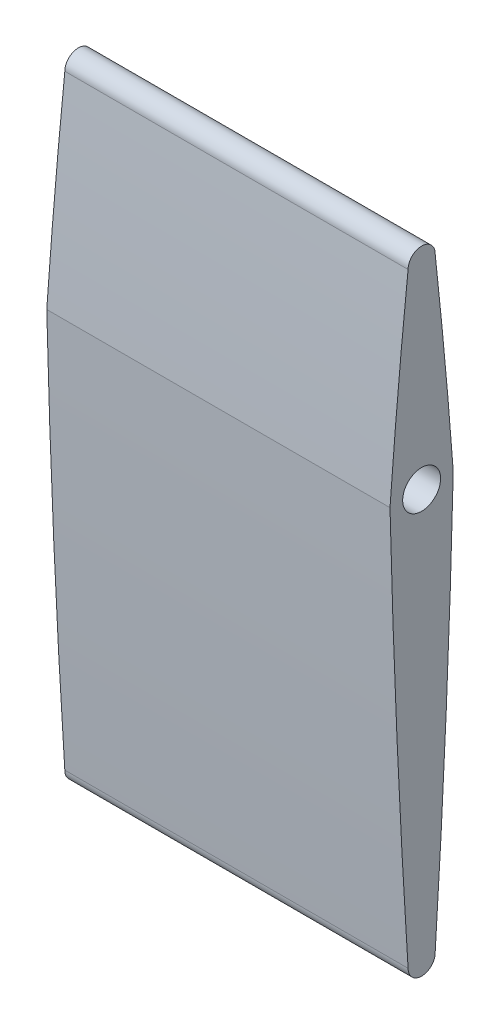
ISO-10303-21;
HEADER;
FILE_DESCRIPTION(('STEP AP214'),'2;1');
FILE_NAME('part.step','',(''),(''),'','','');
FILE_SCHEMA(('AUTOMOTIVE_DESIGN { 1 0 10303 214 1 1 1 1 }'));
ENDSEC;
DATA;
#1=APPLICATION_CONTEXT('core data for automotive mechanical design processes');
#2=APPLICATION_PROTOCOL_DEFINITION('international standard','automotive_design',2000,#1);
#3=PRODUCT_CONTEXT('',#1,'mechanical');
#4=PRODUCT('Part','Part','',(#3));
#5=PRODUCT_RELATED_PRODUCT_CATEGORY('part','',(#4));
#6=PRODUCT_DEFINITION_FORMATION('','',#4);
#7=PRODUCT_DEFINITION_CONTEXT('part definition',#1,'design');
#8=PRODUCT_DEFINITION('design','',#6,#7);
#9=PRODUCT_DEFINITION_SHAPE('','',#8);
#10=(LENGTH_UNIT() NAMED_UNIT(*) SI_UNIT(.MILLI.,.METRE.));
#11=(NAMED_UNIT(*) PLANE_ANGLE_UNIT() SI_UNIT($,.RADIAN.));
#12=(NAMED_UNIT(*) SI_UNIT($,.STERADIAN.) SOLID_ANGLE_UNIT());
#13=UNCERTAINTY_MEASURE_WITH_UNIT(LENGTH_MEASURE(1.E-05),#10,'distance_accuracy_value','');
#14=(GEOMETRIC_REPRESENTATION_CONTEXT(3) GLOBAL_UNCERTAINTY_ASSIGNED_CONTEXT((#13)) GLOBAL_UNIT_ASSIGNED_CONTEXT((#10,
#11,#12)) REPRESENTATION_CONTEXT('',''));
#15=CARTESIAN_POINT('',(0.,0.,0.));
#16=DIRECTION('',(0.,0.,1.));
#17=DIRECTION('',(1.,0.,0.));
#18=AXIS2_PLACEMENT_3D('',#15,#16,#17);
#19=CARTESIAN_POINT('',(38.,-10.4997287776051,889.529326925468));
#20=DIRECTION('',(1.,0.,0.));
#21=DIRECTION('',(0.,0.,-1.));
#22=AXIS2_PLACEMENT_3D('',#19,#20,#21);
#23=PLANE('',#22);
#24=CARTESIAN_POINT('',(38.,27.6308662681891,1131.50400766772));
#25=DIRECTION('',(1.,0.,0.));
#26=DIRECTION('',(0.,0.,-1.));
#27=AXIS2_PLACEMENT_3D('',#24,#25,#26);
#28=CIRCLE('',#27,1135.34028475718);
#29=CARTESIAN_POINT('',(38.,-45.1666666666667,-1.50000000000001));
#30=VERTEX_POINT('',#29);
#31=CARTESIAN_POINT('',(38.,0.,-3.49999999999995));
#32=VERTEX_POINT('',#31);
#33=EDGE_CURVE('E152',#30,#32,#28,.T.);
#34=ORIENTED_EDGE('',*,*,#33,.T.);
#35=CARTESIAN_POINT('',(38.,-48.6303238233992,647.554646183219));
#36=DIRECTION('',(1.,0.,0.));
#37=DIRECTION('',(0.,0.,-1.));
#38=AXIS2_PLACEMENT_3D('',#35,#36,#37);
#39=CIRCLE('',#38,652.868333365867);
#40=CARTESIAN_POINT('',(38.,21.8333333333333,-1.5));
#41=VERTEX_POINT('',#40);
#42=EDGE_CURVE('E100',#32,#41,#39,.T.);
#43=ORIENTED_EDGE('',*,*,#42,.T.);
#44=CARTESIAN_POINT('',(38.,21.8333333333333,0.));
#45=DIRECTION('',(1.,0.,0.));
#46=DIRECTION('',(0.,0.,-1.));
#47=AXIS2_PLACEMENT_3D('',#44,#45,#46);
#48=CIRCLE('',#47,1.5);
#49=CARTESIAN_POINT('',(38.,21.8333333333333,1.49999999999995));
#50=VERTEX_POINT('',#49);
#51=EDGE_CURVE('E113',#41,#50,#48,.T.);
#52=ORIENTED_EDGE('',*,*,#51,.T.);
#53=CARTESIAN_POINT('',(38.,-48.6303238233992,-647.554646183219));
#54=DIRECTION('',(1.,0.,0.));
#55=DIRECTION('',(0.,0.,1.));
#56=AXIS2_PLACEMENT_3D('',#53,#54,#55);
#57=CIRCLE('',#56,652.868333365867);
#58=CARTESIAN_POINT('',(38.,-5.72458747072346E-13,3.50000000000006));
#59=VERTEX_POINT('',#58);
#60=EDGE_CURVE('E107',#50,#59,#57,.T.);
#61=ORIENTED_EDGE('',*,*,#60,.T.);
#62=CARTESIAN_POINT('',(38.,27.6308662681891,-1131.50400766772));
#63=DIRECTION('',(1.,0.,0.));
#64=DIRECTION('',(0.,0.,1.));
#65=AXIS2_PLACEMENT_3D('',#62,#63,#64);
#66=CIRCLE('',#65,1135.34028475718);
#67=CARTESIAN_POINT('',(38.,-45.1666666666667,1.5));
#68=VERTEX_POINT('',#67);
#69=EDGE_CURVE('E111',#59,#68,#66,.T.);
#70=ORIENTED_EDGE('',*,*,#69,.T.);
#71=CARTESIAN_POINT('',(38.,-45.1666666666667,0.));
#72=DIRECTION('',(1.,0.,0.));
#73=DIRECTION('',(0.,0.,-1.));
#74=AXIS2_PLACEMENT_3D('',#71,#72,#73);
#75=CIRCLE('',#74,1.5);
#76=EDGE_CURVE('E63',#68,#30,#75,.T.);
#77=ORIENTED_EDGE('',*,*,#76,.T.);
#78=EDGE_LOOP('',(#34,#43,#52,#61,#70,#77));
#79=FACE_BOUND('',#78,.T.);
#80=CARTESIAN_POINT('',(38.,0.,0.));
#81=DIRECTION('',(1.,0.,0.));
#82=DIRECTION('',(0.,0.,-1.));
#83=AXIS2_PLACEMENT_3D('',#80,#81,#82);
#84=CIRCLE('',#83,2.1);
#85=CARTESIAN_POINT('',(38.,0.,-2.1));
#86=VERTEX_POINT('',#85);
#87=EDGE_CURVE('E140',#86,#86,#84,.T.);
#88=ORIENTED_EDGE('',*,*,#87,.F.);
#89=EDGE_LOOP('',(#88));
#90=FACE_BOUND('',#89,.T.);
#91=ADVANCED_FACE('F45',(#79,#90),#23,.T.);
#92=CARTESIAN_POINT('',(0.,-10.4997287776051,889.529326925468));
#93=DIRECTION('',(1.,0.,0.));
#94=DIRECTION('',(0.,0.,-1.));
#95=AXIS2_PLACEMENT_3D('',#92,#93,#94);
#96=PLANE('',#95);
#97=CARTESIAN_POINT('',(0.,27.6308662681891,1131.50400766772));
#98=DIRECTION('',(1.,0.,0.));
#99=DIRECTION('',(0.,0.,-1.));
#100=AXIS2_PLACEMENT_3D('',#97,#98,#99);
#101=CIRCLE('',#100,1135.34028475718);
#102=CARTESIAN_POINT('',(0.,-45.1666666666667,-1.50000000000001));
#103=VERTEX_POINT('',#102);
#104=CARTESIAN_POINT('',(0.,0.,-3.49999999999995));
#105=VERTEX_POINT('',#104);
#106=EDGE_CURVE('E135',#103,#105,#101,.T.);
#107=ORIENTED_EDGE('',*,*,#106,.F.);
#108=CARTESIAN_POINT('',(0.,-45.1666666666667,0.));
#109=DIRECTION('',(1.,0.,0.));
#110=DIRECTION('',(0.,0.,-1.));
#111=AXIS2_PLACEMENT_3D('',#108,#109,#110);
#112=CIRCLE('',#111,1.5);
#113=CARTESIAN_POINT('',(0.,-45.1666666666667,1.5));
#114=VERTEX_POINT('',#113);
#115=EDGE_CURVE('E92',#114,#103,#112,.T.);
#116=ORIENTED_EDGE('',*,*,#115,.F.);
#117=CARTESIAN_POINT('',(0.,27.6308662681891,-1131.50400766772));
#118=DIRECTION('',(1.,0.,0.));
#119=DIRECTION('',(0.,0.,1.));
#120=AXIS2_PLACEMENT_3D('',#117,#118,#119);
#121=CIRCLE('',#120,1135.34028475718);
#122=CARTESIAN_POINT('',(0.,-5.72458747072346E-13,3.50000000000006));
#123=VERTEX_POINT('',#122);
#124=EDGE_CURVE('E86',#123,#114,#121,.T.);
#125=ORIENTED_EDGE('',*,*,#124,.F.);
#126=CARTESIAN_POINT('',(0.,-48.6303238233992,-647.554646183219));
#127=DIRECTION('',(1.,0.,0.));
#128=DIRECTION('',(0.,0.,1.));
#129=AXIS2_PLACEMENT_3D('',#126,#127,#128);
#130=CIRCLE('',#129,652.868333365867);
#131=CARTESIAN_POINT('',(0.,21.8333333333333,1.49999999999995));
#132=VERTEX_POINT('',#131);
#133=EDGE_CURVE('E122',#132,#123,#130,.T.);
#134=ORIENTED_EDGE('',*,*,#133,.F.);
#135=CARTESIAN_POINT('',(0.,21.8333333333333,0.));
#136=DIRECTION('',(1.,0.,0.));
#137=DIRECTION('',(0.,0.,-1.));
#138=AXIS2_PLACEMENT_3D('',#135,#136,#137);
#139=CIRCLE('',#138,1.5);
#140=CARTESIAN_POINT('',(0.,21.8333333333333,-1.5));
#141=VERTEX_POINT('',#140);
#142=EDGE_CURVE('E143',#141,#132,#139,.T.);
#143=ORIENTED_EDGE('',*,*,#142,.F.);
#144=CARTESIAN_POINT('',(0.,-48.6303238233992,647.554646183219));
#145=DIRECTION('',(1.,0.,0.));
#146=DIRECTION('',(0.,0.,-1.));
#147=AXIS2_PLACEMENT_3D('',#144,#145,#146);
#148=CIRCLE('',#147,652.868333365867);
#149=EDGE_CURVE('E139',#105,#141,#148,.T.);
#150=ORIENTED_EDGE('',*,*,#149,.F.);
#151=EDGE_LOOP('',(#107,#116,#125,#134,#143,#150));
#152=FACE_BOUND('',#151,.T.);
#153=CARTESIAN_POINT('',(0.,0.,0.));
#154=DIRECTION('',(1.,0.,0.));
#155=DIRECTION('',(0.,0.,-1.));
#156=AXIS2_PLACEMENT_3D('',#153,#154,#155);
#157=CIRCLE('',#156,2.1);
#158=CARTESIAN_POINT('',(0.,0.,-2.1));
#159=VERTEX_POINT('',#158);
#160=EDGE_CURVE('E249',#159,#159,#157,.T.);
#161=ORIENTED_EDGE('',*,*,#160,.T.);
#162=EDGE_LOOP('',(#161));
#163=FACE_BOUND('',#162,.T.);
#164=ADVANCED_FACE('F165',(#152,#163),#96,.F.);
#165=CARTESIAN_POINT('',(38.,27.6308662681891,1131.50400766772));
#166=DIRECTION('',(-1.,0.,0.));
#167=DIRECTION('',(0.,0.,1.));
#168=AXIS2_PLACEMENT_3D('',#165,#166,#167);
#169=CYLINDRICAL_SURFACE('',#168,1135.34028475718);
#170=ORIENTED_EDGE('',*,*,#106,.T.);
#171=DIRECTION('',(-1.,0.,0.));
#172=VECTOR('',#171,1.);
#173=CARTESIAN_POINT('',(38.,0.,-3.49999999999995));
#174=LINE('',#173,#172);
#175=EDGE_CURVE('E11',#32,#105,#174,.T.);
#176=ORIENTED_EDGE('',*,*,#175,.F.);
#177=ORIENTED_EDGE('',*,*,#33,.F.);
#178=DIRECTION('',(-1.,0.,0.));
#179=VECTOR('',#178,1.);
#180=CARTESIAN_POINT('',(38.,-45.1666666666667,-1.50000000000001));
#181=LINE('',#180,#179);
#182=EDGE_CURVE('E131',#30,#103,#181,.T.);
#183=ORIENTED_EDGE('',*,*,#182,.T.);
#184=EDGE_LOOP('',(#170,#176,#177,#183));
#185=FACE_BOUND('',#184,.T.);
#186=ADVANCED_FACE('F47',(#185),#169,.T.);
#187=CARTESIAN_POINT('',(38.,-48.6303238233992,647.554646183219));
#188=DIRECTION('',(-1.,0.,0.));
#189=DIRECTION('',(0.,0.,1.));
#190=AXIS2_PLACEMENT_3D('',#187,#188,#189);
#191=CYLINDRICAL_SURFACE('',#190,652.868333365867);
#192=ORIENTED_EDGE('',*,*,#149,.T.);
#193=DIRECTION('',(-1.,0.,0.));
#194=VECTOR('',#193,1.);
#195=CARTESIAN_POINT('',(38.,21.8333333333333,-1.5));
#196=LINE('',#195,#194);
#197=EDGE_CURVE('E55',#41,#141,#196,.T.);
#198=ORIENTED_EDGE('',*,*,#197,.F.);
#199=ORIENTED_EDGE('',*,*,#42,.F.);
#200=ORIENTED_EDGE('',*,*,#175,.T.);
#201=EDGE_LOOP('',(#192,#198,#199,#200));
#202=FACE_BOUND('',#201,.T.);
#203=ADVANCED_FACE('F190',(#202),#191,.T.);
#204=CARTESIAN_POINT('',(38.,21.8333333333333,0.));
#205=DIRECTION('',(-1.,0.,0.));
#206=DIRECTION('',(0.,0.,1.));
#207=AXIS2_PLACEMENT_3D('',#204,#205,#206);
#208=CYLINDRICAL_SURFACE('',#207,1.5);
#209=ORIENTED_EDGE('',*,*,#142,.T.);
#210=DIRECTION('',(-1.,0.,0.));
#211=VECTOR('',#210,1.);
#212=CARTESIAN_POINT('',(38.,21.8333333333333,1.49999999999995));
#213=LINE('',#212,#211);
#214=EDGE_CURVE('E124',#50,#132,#213,.T.);
#215=ORIENTED_EDGE('',*,*,#214,.F.);
#216=ORIENTED_EDGE('',*,*,#51,.F.);
#217=ORIENTED_EDGE('',*,*,#197,.T.);
#218=EDGE_LOOP('',(#209,#215,#216,#217));
#219=FACE_BOUND('',#218,.T.);
#220=ADVANCED_FACE('F162',(#219),#208,.T.);
#221=CARTESIAN_POINT('',(38.,-48.6303238233992,-647.554646183219));
#222=DIRECTION('',(-1.,0.,0.));
#223=DIRECTION('',(0.,0.,1.));
#224=AXIS2_PLACEMENT_3D('',#221,#222,#223);
#225=CYLINDRICAL_SURFACE('',#224,652.868333365867);
#226=ORIENTED_EDGE('',*,*,#133,.T.);
#227=DIRECTION('',(-1.,0.,0.));
#228=VECTOR('',#227,1.);
#229=CARTESIAN_POINT('',(38.,-5.72458747072346E-13,3.50000000000006));
#230=LINE('',#229,#228);
#231=EDGE_CURVE('E119',#59,#123,#230,.T.);
#232=ORIENTED_EDGE('',*,*,#231,.F.);
#233=ORIENTED_EDGE('',*,*,#60,.F.);
#234=ORIENTED_EDGE('',*,*,#214,.T.);
#235=EDGE_LOOP('',(#226,#232,#233,#234));
#236=FACE_BOUND('',#235,.T.);
#237=ADVANCED_FACE('F120',(#236),#225,.T.);
#238=CARTESIAN_POINT('',(38.,27.6308662681891,-1131.50400766772));
#239=DIRECTION('',(-1.,0.,0.));
#240=DIRECTION('',(0.,0.,1.));
#241=AXIS2_PLACEMENT_3D('',#238,#239,#240);
#242=CYLINDRICAL_SURFACE('',#241,1135.34028475718);
#243=ORIENTED_EDGE('',*,*,#124,.T.);
#244=DIRECTION('',(-1.,0.,0.));
#245=VECTOR('',#244,1.);
#246=CARTESIAN_POINT('',(38.,-45.1666666666667,1.5));
#247=LINE('',#246,#245);
#248=EDGE_CURVE('E125',#68,#114,#247,.T.);
#249=ORIENTED_EDGE('',*,*,#248,.F.);
#250=ORIENTED_EDGE('',*,*,#69,.F.);
#251=ORIENTED_EDGE('',*,*,#231,.T.);
#252=EDGE_LOOP('',(#243,#249,#250,#251));
#253=FACE_BOUND('',#252,.T.);
#254=ADVANCED_FACE('F127',(#253),#242,.T.);
#255=CARTESIAN_POINT('',(38.,-45.1666666666667,0.));
#256=DIRECTION('',(-1.,0.,0.));
#257=DIRECTION('',(0.,0.,1.));
#258=AXIS2_PLACEMENT_3D('',#255,#256,#257);
#259=CYLINDRICAL_SURFACE('',#258,1.5);
#260=ORIENTED_EDGE('',*,*,#115,.T.);
#261=ORIENTED_EDGE('',*,*,#182,.F.);
#262=ORIENTED_EDGE('',*,*,#76,.F.);
#263=ORIENTED_EDGE('',*,*,#248,.T.);
#264=EDGE_LOOP('',(#260,#261,#262,#263));
#265=FACE_BOUND('',#264,.T.);
#266=ADVANCED_FACE('F170',(#265),#259,.T.);
#267=CARTESIAN_POINT('',(38.,0.,0.));
#268=DIRECTION('',(-1.,0.,0.));
#269=DIRECTION('',(0.,0.,1.));
#270=AXIS2_PLACEMENT_3D('',#267,#268,#269);
#271=CYLINDRICAL_SURFACE('',#270,2.1);
#272=ORIENTED_EDGE('',*,*,#87,.T.);
#273=EDGE_LOOP('',(#272));
#274=FACE_BOUND('',#273,.T.);
#275=ORIENTED_EDGE('',*,*,#160,.F.);
#276=EDGE_LOOP('',(#275));
#277=FACE_BOUND('',#276,.T.);
#278=ADVANCED_FACE('F172',(#274,#277),#271,.F.);
#279=CLOSED_SHELL('',(#91,#164,#186,#203,#220,#237,#254,#266,#278));
#280=MANIFOLD_SOLID_BREP('B2',#279);
#281=ADVANCED_BREP_SHAPE_REPRESENTATION('',(#18,#280),#14);
#282=SHAPE_DEFINITION_REPRESENTATION(#9,#281);
ENDSEC;
END-ISO-10303-21;
